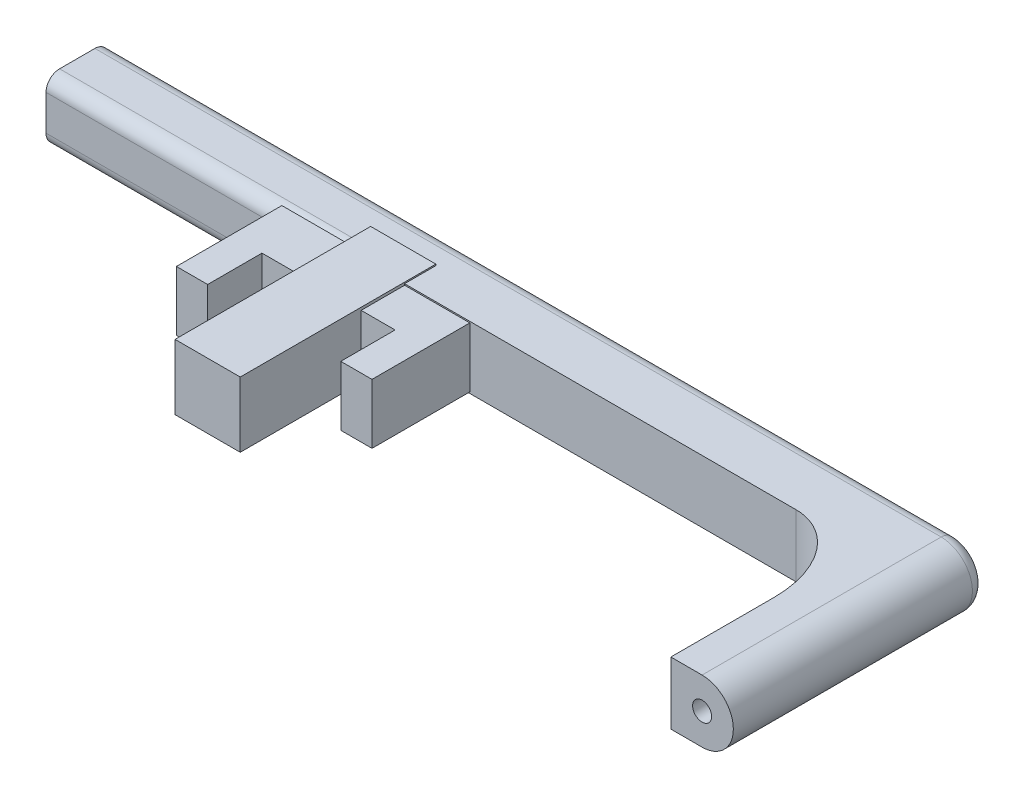
ISO-10303-21;
HEADER;
FILE_DESCRIPTION(('STEP AP214'),'2;1');
FILE_NAME('part.step','',(''),(''),'','','');
FILE_SCHEMA(('AUTOMOTIVE_DESIGN { 1 0 10303 214 1 1 1 1 }'));
ENDSEC;
DATA;
#1=APPLICATION_CONTEXT('core data for automotive mechanical design processes');
#2=APPLICATION_PROTOCOL_DEFINITION('international standard','automotive_design',2000,#1);
#3=PRODUCT_CONTEXT('',#1,'mechanical');
#4=PRODUCT('Part','Part','',(#3));
#5=PRODUCT_RELATED_PRODUCT_CATEGORY('part','',(#4));
#6=PRODUCT_DEFINITION_FORMATION('','',#4);
#7=PRODUCT_DEFINITION_CONTEXT('part definition',#1,'design');
#8=PRODUCT_DEFINITION('design','',#6,#7);
#9=PRODUCT_DEFINITION_SHAPE('','',#8);
#10=(LENGTH_UNIT() NAMED_UNIT(*) SI_UNIT(.MILLI.,.METRE.));
#11=(NAMED_UNIT(*) PLANE_ANGLE_UNIT() SI_UNIT($,.RADIAN.));
#12=(NAMED_UNIT(*) SI_UNIT($,.STERADIAN.) SOLID_ANGLE_UNIT());
#13=UNCERTAINTY_MEASURE_WITH_UNIT(LENGTH_MEASURE(1.E-05),#10,'distance_accuracy_value','');
#14=(GEOMETRIC_REPRESENTATION_CONTEXT(3) GLOBAL_UNCERTAINTY_ASSIGNED_CONTEXT((#13)) GLOBAL_UNIT_ASSIGNED_CONTEXT((#10,
#11,#12)) REPRESENTATION_CONTEXT('',''));
#15=CARTESIAN_POINT('',(0.,0.,0.));
#16=DIRECTION('',(0.,0.,1.));
#17=DIRECTION('',(1.,0.,0.));
#18=AXIS2_PLACEMENT_3D('',#15,#16,#17);
#19=CARTESIAN_POINT('',(-12.,-0.65,0.65));
#20=DIRECTION('',(1.,0.,0.));
#21=DIRECTION('',(0.,0.,-1.));
#22=AXIS2_PLACEMENT_3D('',#19,#20,#21);
#23=CYLINDRICAL_SURFACE('',#22,0.5);
#24=CARTESIAN_POINT('',(-1.2,-0.65,0.65));
#25=DIRECTION('',(1.,0.,0.));
#26=DIRECTION('',(0.,0.,-1.));
#27=AXIS2_PLACEMENT_3D('',#24,#25,#26);
#28=CIRCLE('',#27,0.5);
#29=CARTESIAN_POINT('',(-1.2,-1.1,0.867944947177033));
#30=VERTEX_POINT('',#29);
#31=CARTESIAN_POINT('',(-1.2,-1.15,0.65));
#32=VERTEX_POINT('',#31);
#33=EDGE_CURVE('E524',#30,#32,#28,.T.);
#34=ORIENTED_EDGE('',*,*,#33,.F.);
#35=DIRECTION('',(1.,0.,0.));
#36=VECTOR('',#35,1.);
#37=CARTESIAN_POINT('',(-12.,-1.1,0.867944947177034));
#38=LINE('',#37,#36);
#39=CARTESIAN_POINT('',(-3.6,-1.1,0.867944947177034));
#40=VERTEX_POINT('',#39);
#41=EDGE_CURVE('E536',#40,#30,#38,.T.);
#42=ORIENTED_EDGE('',*,*,#41,.F.);
#43=CARTESIAN_POINT('',(-3.6,-0.65,0.65));
#44=DIRECTION('',(-1.,0.,0.));
#45=DIRECTION('',(0.,-1.,0.));
#46=AXIS2_PLACEMENT_3D('',#43,#44,#45);
#47=CIRCLE('',#46,0.5);
#48=CARTESIAN_POINT('',(-3.6,-0.65,1.15));
#49=VERTEX_POINT('',#48);
#50=EDGE_CURVE('E306',#49,#40,#47,.F.);
#51=ORIENTED_EDGE('',*,*,#50,.F.);
#52=DIRECTION('',(1.,0.,0.));
#53=VECTOR('',#52,1.);
#54=CARTESIAN_POINT('',(-12.,-0.65,1.15));
#55=LINE('',#54,#53);
#56=CARTESIAN_POINT('',(-12.,-0.65,1.15));
#57=VERTEX_POINT('',#56);
#58=EDGE_CURVE('E516',#57,#49,#55,.T.);
#59=ORIENTED_EDGE('',*,*,#58,.F.);
#60=CARTESIAN_POINT('',(-12.,-0.65,0.65));
#61=DIRECTION('',(-1.,0.,0.));
#62=DIRECTION('',(0.,0.,1.));
#63=AXIS2_PLACEMENT_3D('',#60,#61,#62);
#64=CIRCLE('',#63,0.5);
#65=CARTESIAN_POINT('',(-12.,-1.15,0.65));
#66=VERTEX_POINT('',#65);
#67=EDGE_CURVE('E508',#66,#57,#64,.T.);
#68=ORIENTED_EDGE('',*,*,#67,.F.);
#69=DIRECTION('',(1.,0.,0.));
#70=VECTOR('',#69,1.);
#71=CARTESIAN_POINT('',(-12.,-1.15,0.65));
#72=LINE('',#71,#70);
#73=EDGE_CURVE('E487',#32,#66,#72,.F.);
#74=ORIENTED_EDGE('',*,*,#73,.F.);
#75=EDGE_LOOP('',(#34,#42,#51,#59,#68,#74));
#76=FACE_BOUND('',#75,.T.);
#77=ADVANCED_FACE('F43',(#76),#23,.T.);
#78=CARTESIAN_POINT('',(-12.,0.65,0.65));
#79=DIRECTION('',(1.,0.,0.));
#80=DIRECTION('',(0.,0.,-1.));
#81=AXIS2_PLACEMENT_3D('',#78,#79,#80);
#82=CYLINDRICAL_SURFACE('',#81,0.5);
#83=DIRECTION('',(1.,0.,0.));
#84=VECTOR('',#83,1.);
#85=CARTESIAN_POINT('',(-12.,1.1,0.867944947177033));
#86=LINE('',#85,#84);
#87=CARTESIAN_POINT('',(-3.6,1.1,0.867944947177033));
#88=VERTEX_POINT('',#87);
#89=CARTESIAN_POINT('',(-1.2,1.1,0.867944947177033));
#90=VERTEX_POINT('',#89);
#91=EDGE_CURVE('E534',#88,#90,#86,.T.);
#92=ORIENTED_EDGE('',*,*,#91,.T.);
#93=CARTESIAN_POINT('',(-1.2,0.65,0.65));
#94=DIRECTION('',(1.,0.,0.));
#95=DIRECTION('',(0.,0.,-1.));
#96=AXIS2_PLACEMENT_3D('',#93,#94,#95);
#97=CIRCLE('',#96,0.5);
#98=CARTESIAN_POINT('',(-1.2,1.15,0.65));
#99=VERTEX_POINT('',#98);
#100=EDGE_CURVE('E526',#99,#90,#97,.T.);
#101=ORIENTED_EDGE('',*,*,#100,.F.);
#102=DIRECTION('',(1.,0.,0.));
#103=VECTOR('',#102,1.);
#104=CARTESIAN_POINT('',(-12.,1.15,0.65));
#105=LINE('',#104,#103);
#106=CARTESIAN_POINT('',(-12.,1.15,0.65));
#107=VERTEX_POINT('',#106);
#108=EDGE_CURVE('E521',#107,#99,#105,.T.);
#109=ORIENTED_EDGE('',*,*,#108,.F.);
#110=CARTESIAN_POINT('',(-12.,0.65,0.65));
#111=DIRECTION('',(-1.,0.,0.));
#112=DIRECTION('',(0.,0.,1.));
#113=AXIS2_PLACEMENT_3D('',#110,#111,#112);
#114=CIRCLE('',#113,0.5);
#115=CARTESIAN_POINT('',(-12.,0.65,1.15));
#116=VERTEX_POINT('',#115);
#117=EDGE_CURVE('E506',#116,#107,#114,.T.);
#118=ORIENTED_EDGE('',*,*,#117,.F.);
#119=DIRECTION('',(1.,0.,0.));
#120=VECTOR('',#119,1.);
#121=CARTESIAN_POINT('',(-12.,0.65,1.15));
#122=LINE('',#121,#120);
#123=CARTESIAN_POINT('',(-3.6,0.65,1.15));
#124=VERTEX_POINT('',#123);
#125=EDGE_CURVE('E514',#124,#116,#122,.F.);
#126=ORIENTED_EDGE('',*,*,#125,.F.);
#127=CARTESIAN_POINT('',(-3.6,0.65,0.65));
#128=DIRECTION('',(-1.,0.,0.));
#129=DIRECTION('',(0.,-1.,0.));
#130=AXIS2_PLACEMENT_3D('',#127,#128,#129);
#131=CIRCLE('',#130,0.5);
#132=EDGE_CURVE('E528',#88,#124,#131,.F.);
#133=ORIENTED_EDGE('',*,*,#132,.F.);
#134=EDGE_LOOP('',(#92,#101,#109,#118,#126,#133));
#135=FACE_BOUND('',#134,.T.);
#136=ADVANCED_FACE('F45',(#135),#82,.T.);
#137=CARTESIAN_POINT('',(1.2,-1.2,7.2));
#138=DIRECTION('',(-1.,0.,0.));
#139=DIRECTION('',(0.,0.,1.));
#140=AXIS2_PLACEMENT_3D('',#137,#138,#139);
#141=PLANE('',#140);
#142=DIRECTION('',(0.,0.,1.));
#143=VECTOR('',#142,1.);
#144=CARTESIAN_POINT('',(1.2,1.1,7.2));
#145=LINE('',#144,#143);
#146=CARTESIAN_POINT('',(1.2,1.1,1.15));
#147=VERTEX_POINT('',#146);
#148=CARTESIAN_POINT('',(1.2,1.1,2.75));
#149=VERTEX_POINT('',#148);
#150=EDGE_CURVE('E264',#147,#149,#145,.T.);
#151=ORIENTED_EDGE('',*,*,#150,.F.);
#152=DIRECTION('',(0.,1.,0.));
#153=VECTOR('',#152,1.);
#154=CARTESIAN_POINT('',(1.2,-1.2,1.15));
#155=LINE('',#154,#153);
#156=CARTESIAN_POINT('',(1.2,1.15,1.15));
#157=VERTEX_POINT('',#156);
#158=EDGE_CURVE('E567',#147,#157,#155,.T.);
#159=ORIENTED_EDGE('',*,*,#158,.T.);
#160=DIRECTION('',(0.,0.,-1.));
#161=VECTOR('',#160,1.);
#162=CARTESIAN_POINT('',(1.2,1.15,7.2));
#163=LINE('',#162,#161);
#164=CARTESIAN_POINT('',(1.2,1.15,0.));
#165=VERTEX_POINT('',#164);
#166=EDGE_CURVE('E661',#157,#165,#163,.T.);
#167=ORIENTED_EDGE('',*,*,#166,.T.);
#168=DIRECTION('',(0.,1.,0.));
#169=VECTOR('',#168,1.);
#170=CARTESIAN_POINT('',(1.2,-1.2,0.));
#171=LINE('',#170,#169);
#172=CARTESIAN_POINT('',(1.2,1.2,0.));
#173=VERTEX_POINT('',#172);
#174=EDGE_CURVE('E566',#165,#173,#171,.T.);
#175=ORIENTED_EDGE('',*,*,#174,.T.);
#176=DIRECTION('',(0.,0.,-1.));
#177=VECTOR('',#176,1.);
#178=CARTESIAN_POINT('',(1.2,1.2,7.2));
#179=LINE('',#178,#177);
#180=CARTESIAN_POINT('',(1.2,1.2,7.2));
#181=VERTEX_POINT('',#180);
#182=EDGE_CURVE('E600',#181,#173,#179,.T.);
#183=ORIENTED_EDGE('',*,*,#182,.F.);
#184=DIRECTION('',(0.,1.,0.));
#185=VECTOR('',#184,1.);
#186=CARTESIAN_POINT('',(1.2,-1.2,7.2));
#187=LINE('',#186,#185);
#188=CARTESIAN_POINT('',(1.2,-1.2,7.2));
#189=VERTEX_POINT('',#188);
#190=EDGE_CURVE('E574',#189,#181,#187,.T.);
#191=ORIENTED_EDGE('',*,*,#190,.F.);
#192=DIRECTION('',(0.,0.,-1.));
#193=VECTOR('',#192,1.);
#194=CARTESIAN_POINT('',(1.2,-1.2,7.2));
#195=LINE('',#194,#193);
#196=CARTESIAN_POINT('',(1.2,-1.2,0.));
#197=VERTEX_POINT('',#196);
#198=EDGE_CURVE('E583',#189,#197,#195,.T.);
#199=ORIENTED_EDGE('',*,*,#198,.T.);
#200=CARTESIAN_POINT('',(1.2,-1.15,0.));
#201=VERTEX_POINT('',#200);
#202=EDGE_CURVE('E569',#197,#201,#171,.T.);
#203=ORIENTED_EDGE('',*,*,#202,.T.);
#204=DIRECTION('',(0.,0.,1.));
#205=VECTOR('',#204,1.);
#206=CARTESIAN_POINT('',(1.2,-1.15,7.2));
#207=LINE('',#206,#205);
#208=CARTESIAN_POINT('',(1.2,-1.15,1.15));
#209=VERTEX_POINT('',#208);
#210=EDGE_CURVE('E564',#201,#209,#207,.T.);
#211=ORIENTED_EDGE('',*,*,#210,.T.);
#212=CARTESIAN_POINT('',(1.2,-1.1,1.15));
#213=VERTEX_POINT('',#212);
#214=EDGE_CURVE('E561',#209,#213,#155,.T.);
#215=ORIENTED_EDGE('',*,*,#214,.T.);
#216=DIRECTION('',(0.,0.,-1.));
#217=VECTOR('',#216,1.);
#218=CARTESIAN_POINT('',(1.2,-1.1,7.2));
#219=LINE('',#218,#217);
#220=CARTESIAN_POINT('',(1.2,-1.1,2.75));
#221=VERTEX_POINT('',#220);
#222=EDGE_CURVE('E555',#221,#213,#219,.T.);
#223=ORIENTED_EDGE('',*,*,#222,.F.);
#224=DIRECTION('',(0.,-1.,0.));
#225=VECTOR('',#224,1.);
#226=CARTESIAN_POINT('',(1.2,-1.2,2.75));
#227=LINE('',#226,#225);
#228=EDGE_CURVE('E559',#149,#221,#227,.T.);
#229=ORIENTED_EDGE('',*,*,#228,.F.);
#230=EDGE_LOOP('',(#151,#159,#167,#175,#183,#191,#199,#203,#211,#215,#223,#229));
#231=FACE_BOUND('',#230,.T.);
#232=ADVANCED_FACE('F448',(#231),#141,.F.);
#233=CARTESIAN_POINT('',(-1.2,-1.2,7.2));
#234=DIRECTION('',(1.,0.,0.));
#235=DIRECTION('',(0.,0.,-1.));
#236=AXIS2_PLACEMENT_3D('',#233,#234,#235);
#237=PLANE('',#236);
#238=DIRECTION('',(0.,0.,-1.));
#239=VECTOR('',#238,1.);
#240=CARTESIAN_POINT('',(-1.2,1.1,7.2));
#241=LINE('',#240,#239);
#242=CARTESIAN_POINT('',(-1.2,1.1,2.75));
#243=VERTEX_POINT('',#242);
#244=EDGE_CURVE('E58',#243,#90,#241,.T.);
#245=ORIENTED_EDGE('',*,*,#244,.F.);
#246=DIRECTION('',(0.,1.,0.));
#247=VECTOR('',#246,1.);
#248=CARTESIAN_POINT('',(-1.2,-1.2,2.75));
#249=LINE('',#248,#247);
#250=CARTESIAN_POINT('',(-1.2,-1.1,2.75));
#251=VERTEX_POINT('',#250);
#252=EDGE_CURVE('E62',#251,#243,#249,.T.);
#253=ORIENTED_EDGE('',*,*,#252,.F.);
#254=DIRECTION('',(0.,0.,1.));
#255=VECTOR('',#254,1.);
#256=CARTESIAN_POINT('',(-1.2,-1.1,7.2));
#257=LINE('',#256,#255);
#258=EDGE_CURVE('E558',#30,#251,#257,.T.);
#259=ORIENTED_EDGE('',*,*,#258,.F.);
#260=ORIENTED_EDGE('',*,*,#33,.T.);
#261=DIRECTION('',(0.,0.,-1.));
#262=VECTOR('',#261,1.);
#263=CARTESIAN_POINT('',(-1.2,-1.15,7.2));
#264=LINE('',#263,#262);
#265=CARTESIAN_POINT('',(-1.2,-1.15,0.));
#266=VERTEX_POINT('',#265);
#267=EDGE_CURVE('E648',#32,#266,#264,.T.);
#268=ORIENTED_EDGE('',*,*,#267,.T.);
#269=DIRECTION('',(0.,-1.,0.));
#270=VECTOR('',#269,1.);
#271=CARTESIAN_POINT('',(-1.2,-1.2,0.));
#272=LINE('',#271,#270);
#273=CARTESIAN_POINT('',(-1.2,-1.2,0.));
#274=VERTEX_POINT('',#273);
#275=EDGE_CURVE('E587',#266,#274,#272,.T.);
#276=ORIENTED_EDGE('',*,*,#275,.T.);
#277=DIRECTION('',(0.,0.,-1.));
#278=VECTOR('',#277,1.);
#279=CARTESIAN_POINT('',(-1.2,-1.2,7.2));
#280=LINE('',#279,#278);
#281=CARTESIAN_POINT('',(-1.2,-1.2,7.2));
#282=VERTEX_POINT('',#281);
#283=EDGE_CURVE('E594',#282,#274,#280,.T.);
#284=ORIENTED_EDGE('',*,*,#283,.F.);
#285=DIRECTION('',(0.,-1.,0.));
#286=VECTOR('',#285,1.);
#287=CARTESIAN_POINT('',(-1.2,-1.2,7.2));
#288=LINE('',#287,#286);
#289=CARTESIAN_POINT('',(-1.2,1.2,7.2));
#290=VERTEX_POINT('',#289);
#291=EDGE_CURVE('E580',#290,#282,#288,.T.);
#292=ORIENTED_EDGE('',*,*,#291,.F.);
#293=DIRECTION('',(0.,0.,-1.));
#294=VECTOR('',#293,1.);
#295=CARTESIAN_POINT('',(-1.2,1.2,7.2));
#296=LINE('',#295,#294);
#297=CARTESIAN_POINT('',(-1.2,1.2,0.));
#298=VERTEX_POINT('',#297);
#299=EDGE_CURVE('E597',#290,#298,#296,.T.);
#300=ORIENTED_EDGE('',*,*,#299,.T.);
#301=CARTESIAN_POINT('',(-1.2,1.15,0.));
#302=VERTEX_POINT('',#301);
#303=EDGE_CURVE('E588',#298,#302,#272,.T.);
#304=ORIENTED_EDGE('',*,*,#303,.T.);
#305=DIRECTION('',(0.,0.,1.));
#306=VECTOR('',#305,1.);
#307=CARTESIAN_POINT('',(-1.2,1.15,7.2));
#308=LINE('',#307,#306);
#309=EDGE_CURVE('E374',#302,#99,#308,.T.);
#310=ORIENTED_EDGE('',*,*,#309,.T.);
#311=ORIENTED_EDGE('',*,*,#100,.T.);
#312=EDGE_LOOP('',(#245,#253,#259,#260,#268,#276,#284,#292,#300,#304,#310,#311));
#313=FACE_BOUND('',#312,.T.);
#314=ADVANCED_FACE('F401',(#313),#237,.F.);
#315=CARTESIAN_POINT('',(-12.,-1.15,1.15));
#316=DIRECTION('',(0.,0.,1.));
#317=DIRECTION('',(1.,0.,0.));
#318=AXIS2_PLACEMENT_3D('',#315,#316,#317);
#319=PLANE('',#318);
#320=ORIENTED_EDGE('',*,*,#158,.F.);
#321=DIRECTION('',(-1.,0.,0.));
#322=VECTOR('',#321,1.);
#323=CARTESIAN_POINT('',(-12.,1.1,1.15));
#324=LINE('',#323,#322);
#325=CARTESIAN_POINT('',(3.6,1.1,1.15));
#326=VERTEX_POINT('',#325);
#327=EDGE_CURVE('E538',#326,#147,#324,.T.);
#328=ORIENTED_EDGE('',*,*,#327,.F.);
#329=DIRECTION('',(0.,1.,0.));
#330=VECTOR('',#329,1.);
#331=CARTESIAN_POINT('',(3.6,-1.15,1.15));
#332=LINE('',#331,#330);
#333=CARTESIAN_POINT('',(3.6,-1.1,1.15));
#334=VERTEX_POINT('',#333);
#335=EDGE_CURVE('E51',#334,#326,#332,.T.);
#336=ORIENTED_EDGE('',*,*,#335,.F.);
#337=DIRECTION('',(-1.,0.,0.));
#338=VECTOR('',#337,1.);
#339=CARTESIAN_POINT('',(-12.,-1.1,1.15));
#340=LINE('',#339,#338);
#341=EDGE_CURVE('E12',#334,#213,#340,.T.);
#342=ORIENTED_EDGE('',*,*,#341,.T.);
#343=ORIENTED_EDGE('',*,*,#214,.F.);
#344=DIRECTION('',(1.,0.,0.));
#345=VECTOR('',#344,1.);
#346=CARTESIAN_POINT('',(-12.,-1.15,1.15));
#347=LINE('',#346,#345);
#348=CARTESIAN_POINT('',(15.6,-1.15,1.15));
#349=VERTEX_POINT('',#348);
#350=EDGE_CURVE('E371',#209,#349,#347,.T.);
#351=ORIENTED_EDGE('',*,*,#350,.T.);
#352=CARTESIAN_POINT('',(15.6,1.265,1.15));
#353=CARTESIAN_POINT('',(15.6,0.421666666666668,1.15));
#354=CARTESIAN_POINT('',(15.6,-0.421666666666668,1.15));
#355=CARTESIAN_POINT('',(15.6,-1.265,1.15));
#356=(BOUNDED_CURVE() B_SPLINE_CURVE(3,(#352,#353,#354,#355),.UNSPECIFIED.,.F.,
.F.) B_SPLINE_CURVE_WITH_KNOTS((4,4),(-0.001265,0.001265),
.UNSPECIFIED.) CURVE() GEOMETRIC_REPRESENTATION_ITEM() RATIONAL_B_SPLINE_CURVE((1.,1.,1.,1.)) REPRESENTATION_ITEM(''));
#357=CARTESIAN_POINT('',(15.6,1.15,1.15));
#358=VERTEX_POINT('',#357);
#359=EDGE_CURVE('E384',#349,#358,#356,.F.);
#360=ORIENTED_EDGE('',*,*,#359,.T.);
#361=DIRECTION('',(1.,0.,0.));
#362=VECTOR('',#361,1.);
#363=CARTESIAN_POINT('',(-12.,1.15,1.15));
#364=LINE('',#363,#362);
#365=EDGE_CURVE('E365',#157,#358,#364,.T.);
#366=ORIENTED_EDGE('',*,*,#365,.F.);
#367=EDGE_LOOP('',(#320,#328,#336,#342,#343,#351,#360,#366));
#368=FACE_BOUND('',#367,.T.);
#369=ADVANCED_FACE('F390',(#368),#319,.T.);
#370=CARTESIAN_POINT('',(-2.45,0.,-0.65));
#371=DIRECTION('',(-1.,0.,0.));
#372=DIRECTION('',(0.,-1.,0.));
#373=AXIS2_PLACEMENT_3D('',#370,#371,#372);
#374=PLANE('',#373);
#375=DIRECTION('',(0.,-1.,0.));
#376=VECTOR('',#375,1.);
#377=CARTESIAN_POINT('',(-2.45,0.,2.75));
#378=LINE('',#377,#376);
#379=CARTESIAN_POINT('',(-2.45,1.1,2.75));
#380=VERTEX_POINT('',#379);
#381=CARTESIAN_POINT('',(-2.45,-1.1,2.75));
#382=VERTEX_POINT('',#381);
#383=EDGE_CURVE('E255',#380,#382,#378,.T.);
#384=ORIENTED_EDGE('',*,*,#383,.F.);
#385=DIRECTION('',(0.,0.,1.));
#386=VECTOR('',#385,1.);
#387=CARTESIAN_POINT('',(-2.45,1.1,-0.65));
#388=LINE('',#387,#386);
#389=CARTESIAN_POINT('',(-2.45,1.1,4.75));
#390=VERTEX_POINT('',#389);
#391=EDGE_CURVE('E296',#380,#390,#388,.T.);
#392=ORIENTED_EDGE('',*,*,#391,.T.);
#393=DIRECTION('',(0.,-1.,0.));
#394=VECTOR('',#393,1.);
#395=CARTESIAN_POINT('',(-2.45,0.,4.75));
#396=LINE('',#395,#394);
#397=CARTESIAN_POINT('',(-2.45,-1.1,4.75));
#398=VERTEX_POINT('',#397);
#399=EDGE_CURVE('E292',#390,#398,#396,.T.);
#400=ORIENTED_EDGE('',*,*,#399,.T.);
#401=DIRECTION('',(0.,0.,1.));
#402=VECTOR('',#401,1.);
#403=CARTESIAN_POINT('',(-2.45,-1.1,-0.65));
#404=LINE('',#403,#402);
#405=EDGE_CURVE('E299',#382,#398,#404,.T.);
#406=ORIENTED_EDGE('',*,*,#405,.F.);
#407=EDGE_LOOP('',(#384,#392,#400,#406));
#408=FACE_BOUND('',#407,.T.);
#409=ADVANCED_FACE('F400',(#408),#374,.F.);
#410=CARTESIAN_POINT('',(2.45,0.,4.75));
#411=DIRECTION('',(-1.,0.,0.));
#412=DIRECTION('',(0.,0.,1.));
#413=AXIS2_PLACEMENT_3D('',#410,#411,#412);
#414=PLANE('',#413);
#415=DIRECTION('',(0.,0.,-1.));
#416=VECTOR('',#415,1.);
#417=CARTESIAN_POINT('',(2.45,1.1,4.75));
#418=LINE('',#417,#416);
#419=CARTESIAN_POINT('',(2.45,1.1,4.75));
#420=VERTEX_POINT('',#419);
#421=CARTESIAN_POINT('',(2.45,1.1,2.75));
#422=VERTEX_POINT('',#421);
#423=EDGE_CURVE('E261',#420,#422,#418,.T.);
#424=ORIENTED_EDGE('',*,*,#423,.T.);
#425=DIRECTION('',(0.,-1.,0.));
#426=VECTOR('',#425,1.);
#427=CARTESIAN_POINT('',(2.45,0.,2.75));
#428=LINE('',#427,#426);
#429=CARTESIAN_POINT('',(2.45,-1.1,2.75));
#430=VERTEX_POINT('',#429);
#431=EDGE_CURVE('E245',#422,#430,#428,.T.);
#432=ORIENTED_EDGE('',*,*,#431,.T.);
#433=DIRECTION('',(0.,0.,-1.));
#434=VECTOR('',#433,1.);
#435=CARTESIAN_POINT('',(2.45,-1.1,4.75));
#436=LINE('',#435,#434);
#437=CARTESIAN_POINT('',(2.45,-1.1,4.75));
#438=VERTEX_POINT('',#437);
#439=EDGE_CURVE('E281',#438,#430,#436,.T.);
#440=ORIENTED_EDGE('',*,*,#439,.F.);
#441=DIRECTION('',(0.,1.,0.));
#442=VECTOR('',#441,1.);
#443=CARTESIAN_POINT('',(2.45,0.,4.75));
#444=LINE('',#443,#442);
#445=EDGE_CURVE('E269',#438,#420,#444,.T.);
#446=ORIENTED_EDGE('',*,*,#445,.T.);
#447=EDGE_LOOP('',(#424,#432,#440,#446));
#448=FACE_BOUND('',#447,.T.);
#449=ADVANCED_FACE('F267',(#448),#414,.T.);
#450=CARTESIAN_POINT('',(0.,0.,0.));
#451=DIRECTION('',(0.,0.,-1.));
#452=DIRECTION('',(-1.,0.,0.));
#453=AXIS2_PLACEMENT_3D('',#450,#451,#452);
#454=PLANE('',#453);
#455=DIRECTION('',(-1.,0.,0.));
#456=VECTOR('',#455,1.);
#457=CARTESIAN_POINT('',(0.,-1.15,0.));
#458=LINE('',#457,#456);
#459=EDGE_CURVE('E342',#201,#266,#458,.T.);
#460=ORIENTED_EDGE('',*,*,#459,.F.);
#461=ORIENTED_EDGE('',*,*,#202,.F.);
#462=DIRECTION('',(1.,0.,0.));
#463=VECTOR('',#462,1.);
#464=CARTESIAN_POINT('',(-1.2,-1.2,0.));
#465=LINE('',#464,#463);
#466=EDGE_CURVE('E578',#274,#197,#465,.T.);
#467=ORIENTED_EDGE('',*,*,#466,.F.);
#468=ORIENTED_EDGE('',*,*,#275,.F.);
#469=EDGE_LOOP('',(#460,#461,#467,#468));
#470=FACE_BOUND('',#469,.T.);
#471=ADVANCED_FACE('F668',(#470),#454,.T.);
#472=CARTESIAN_POINT('',(-1.2,1.2,7.2));
#473=DIRECTION('',(0.,-1.,0.));
#474=DIRECTION('',(0.,0.,-1.));
#475=AXIS2_PLACEMENT_3D('',#472,#473,#474);
#476=PLANE('',#475);
#477=DIRECTION('',(-1.,0.,0.));
#478=VECTOR('',#477,1.);
#479=CARTESIAN_POINT('',(-1.2,1.2,0.));
#480=LINE('',#479,#478);
#481=EDGE_CURVE('E585',#173,#298,#480,.T.);
#482=ORIENTED_EDGE('',*,*,#481,.T.);
#483=ORIENTED_EDGE('',*,*,#299,.F.);
#484=DIRECTION('',(-1.,0.,0.));
#485=VECTOR('',#484,1.);
#486=CARTESIAN_POINT('',(-1.2,1.2,7.2));
#487=LINE('',#486,#485);
#488=EDGE_CURVE('E577',#181,#290,#487,.T.);
#489=ORIENTED_EDGE('',*,*,#488,.F.);
#490=ORIENTED_EDGE('',*,*,#182,.T.);
#491=EDGE_LOOP('',(#482,#483,#489,#490));
#492=FACE_BOUND('',#491,.T.);
#493=ADVANCED_FACE('F796',(#492),#476,.F.);
#494=CARTESIAN_POINT('',(-1.2,-1.2,7.2));
#495=DIRECTION('',(0.,1.,0.));
#496=DIRECTION('',(0.,0.,1.));
#497=AXIS2_PLACEMENT_3D('',#494,#495,#496);
#498=PLANE('',#497);
#499=ORIENTED_EDGE('',*,*,#466,.T.);
#500=ORIENTED_EDGE('',*,*,#198,.F.);
#501=DIRECTION('',(1.,0.,0.));
#502=VECTOR('',#501,1.);
#503=CARTESIAN_POINT('',(-1.2,-1.2,7.2));
#504=LINE('',#503,#502);
#505=EDGE_CURVE('E582',#282,#189,#504,.T.);
#506=ORIENTED_EDGE('',*,*,#505,.F.);
#507=ORIENTED_EDGE('',*,*,#283,.T.);
#508=EDGE_LOOP('',(#499,#500,#506,#507));
#509=FACE_BOUND('',#508,.T.);
#510=ADVANCED_FACE('F672',(#509),#498,.F.);
#511=CARTESIAN_POINT('',(0.,0.,7.2));
#512=DIRECTION('',(0.,0.,-1.));
#513=DIRECTION('',(-1.,0.,0.));
#514=AXIS2_PLACEMENT_3D('',#511,#512,#513);
#515=PLANE('',#514);
#516=ORIENTED_EDGE('',*,*,#190,.T.);
#517=ORIENTED_EDGE('',*,*,#488,.T.);
#518=ORIENTED_EDGE('',*,*,#291,.T.);
#519=ORIENTED_EDGE('',*,*,#505,.T.);
#520=EDGE_LOOP('',(#516,#517,#518,#519));
#521=FACE_BOUND('',#520,.T.);
#522=ADVANCED_FACE('F677',(#521),#515,.F.);
#523=DIRECTION('',(1.,0.,0.));
#524=VECTOR('',#523,1.);
#525=CARTESIAN_POINT('',(0.,1.15,0.));
#526=LINE('',#525,#524);
#527=EDGE_CURVE('E602',#302,#165,#526,.T.);
#528=ORIENTED_EDGE('',*,*,#527,.F.);
#529=ORIENTED_EDGE('',*,*,#303,.F.);
#530=ORIENTED_EDGE('',*,*,#481,.F.);
#531=ORIENTED_EDGE('',*,*,#174,.F.);
#532=EDGE_LOOP('',(#528,#529,#530,#531));
#533=FACE_BOUND('',#532,.T.);
#534=ADVANCED_FACE('F683',(#533),#454,.T.);
#535=DIRECTION('',(0.,-1.,0.));
#536=VECTOR('',#535,1.);
#537=CARTESIAN_POINT('',(-3.6,-1.15,1.15));
#538=LINE('',#537,#536);
#539=EDGE_CURVE('E298',#124,#49,#538,.T.);
#540=ORIENTED_EDGE('',*,*,#539,.F.);
#541=ORIENTED_EDGE('',*,*,#125,.T.);
#542=DIRECTION('',(0.,-1.,0.));
#543=VECTOR('',#542,1.);
#544=CARTESIAN_POINT('',(-12.,-1.15,1.15));
#545=LINE('',#544,#543);
#546=EDGE_CURVE('E359',#116,#57,#545,.T.);
#547=ORIENTED_EDGE('',*,*,#546,.T.);
#548=ORIENTED_EDGE('',*,*,#58,.T.);
#549=EDGE_LOOP('',(#540,#541,#547,#548));
#550=FACE_BOUND('',#549,.T.);
#551=ADVANCED_FACE('F402',(#550),#319,.T.);
#552=CARTESIAN_POINT('',(-12.,-1.15,1.15));
#553=DIRECTION('',(0.,-1.,0.));
#554=DIRECTION('',(0.,0.,-1.));
#555=AXIS2_PLACEMENT_3D('',#552,#553,#554);
#556=PLANE('',#555);
#557=DIRECTION('',(0.,0.,-1.));
#558=VECTOR('',#557,1.);
#559=CARTESIAN_POINT('',(-12.,-1.15,1.15));
#560=LINE('',#559,#558);
#561=CARTESIAN_POINT('',(-12.,-1.15,-0.65));
#562=VERTEX_POINT('',#561);
#563=EDGE_CURVE('E362',#66,#562,#560,.T.);
#564=ORIENTED_EDGE('',*,*,#563,.T.);
#565=DIRECTION('',(1.,0.,0.));
#566=VECTOR('',#565,1.);
#567=CARTESIAN_POINT('',(-12.,-1.15,-0.65));
#568=LINE('',#567,#566);
#569=CARTESIAN_POINT('',(19.15,-1.15,-0.65));
#570=VERTEX_POINT('',#569);
#571=EDGE_CURVE('E494',#562,#570,#568,.T.);
#572=ORIENTED_EDGE('',*,*,#571,.T.);
#573=DIRECTION('',(0.,0.,-1.));
#574=VECTOR('',#573,1.);
#575=CARTESIAN_POINT('',(19.15,-1.15,8.15));
#576=LINE('',#575,#574);
#577=CARTESIAN_POINT('',(19.15,-1.15,8.15));
#578=VERTEX_POINT('',#577);
#579=EDGE_CURVE('E349',#578,#570,#576,.T.);
#580=ORIENTED_EDGE('',*,*,#579,.F.);
#581=DIRECTION('',(1.,0.,0.));
#582=VECTOR('',#581,1.);
#583=CARTESIAN_POINT('',(18.,-1.15,8.15));
#584=LINE('',#583,#582);
#585=CARTESIAN_POINT('',(18.,-1.15,8.15));
#586=VERTEX_POINT('',#585);
#587=EDGE_CURVE('E326',#586,#578,#584,.T.);
#588=ORIENTED_EDGE('',*,*,#587,.F.);
#589=DIRECTION('',(0.,0.,-1.));
#590=VECTOR('',#589,1.);
#591=CARTESIAN_POINT('',(18.,-1.15,8.15));
#592=LINE('',#591,#590);
#593=CARTESIAN_POINT('',(18.,-1.15,4.35));
#594=VERTEX_POINT('',#593);
#595=EDGE_CURVE('E344',#586,#594,#592,.T.);
#596=ORIENTED_EDGE('',*,*,#595,.T.);
#597=CARTESIAN_POINT('',(15.6,-1.15,1.15));
#598=CARTESIAN_POINT('',(18.,-1.15,1.15));
#599=CARTESIAN_POINT('',(18.,-1.15,4.35));
#600=(BOUNDED_CURVE() B_SPLINE_CURVE(2,(#597,#598,#599),.UNSPECIFIED.,.F.,
.F.) B_SPLINE_CURVE_WITH_KNOTS((3,3),(0.,1.),
.UNSPECIFIED.) CURVE() GEOMETRIC_REPRESENTATION_ITEM() RATIONAL_B_SPLINE_CURVE((1.,
0.707106781186548,1.)) REPRESENTATION_ITEM(''));
#601=EDGE_CURVE('E426',#594,#349,#600,.F.);
#602=ORIENTED_EDGE('',*,*,#601,.T.);
#603=ORIENTED_EDGE('',*,*,#350,.F.);
#604=ORIENTED_EDGE('',*,*,#210,.F.);
#605=ORIENTED_EDGE('',*,*,#459,.T.);
#606=ORIENTED_EDGE('',*,*,#267,.F.);
#607=ORIENTED_EDGE('',*,*,#73,.T.);
#608=EDGE_LOOP('',(#564,#572,#580,#588,#596,#602,#603,#604,#605,#606,#607));
#609=FACE_BOUND('',#608,.T.);
#610=ADVANCED_FACE('F403',(#609),#556,.T.);
#611=CARTESIAN_POINT('',(-12.,1.15,1.15));
#612=DIRECTION('',(0.,1.,0.));
#613=DIRECTION('',(0.,0.,1.));
#614=AXIS2_PLACEMENT_3D('',#611,#612,#613);
#615=PLANE('',#614);
#616=DIRECTION('',(0.,0.,1.));
#617=VECTOR('',#616,1.);
#618=CARTESIAN_POINT('',(-12.,1.15,1.15));
#619=LINE('',#618,#617);
#620=CARTESIAN_POINT('',(-12.,1.15,-0.65));
#621=VERTEX_POINT('',#620);
#622=EDGE_CURVE('E356',#621,#107,#619,.T.);
#623=ORIENTED_EDGE('',*,*,#622,.T.);
#624=ORIENTED_EDGE('',*,*,#108,.T.);
#625=ORIENTED_EDGE('',*,*,#309,.F.);
#626=ORIENTED_EDGE('',*,*,#527,.T.);
#627=ORIENTED_EDGE('',*,*,#166,.F.);
#628=ORIENTED_EDGE('',*,*,#365,.T.);
#629=CARTESIAN_POINT('',(18.,1.15,4.35));
#630=CARTESIAN_POINT('',(18.,1.15,1.15));
#631=CARTESIAN_POINT('',(15.6,1.15,1.15));
#632=(BOUNDED_CURVE() B_SPLINE_CURVE(2,(#629,#630,#631),.UNSPECIFIED.,.F.,
.F.) B_SPLINE_CURVE_WITH_KNOTS((3,3),(0.,1.),
.UNSPECIFIED.) CURVE() GEOMETRIC_REPRESENTATION_ITEM() RATIONAL_B_SPLINE_CURVE((1.,
0.707106781186548,1.)) REPRESENTATION_ITEM(''));
#633=CARTESIAN_POINT('',(18.,1.15,4.35));
#634=VERTEX_POINT('',#633);
#635=EDGE_CURVE('E495',#358,#634,#632,.F.);
#636=ORIENTED_EDGE('',*,*,#635,.T.);
#637=DIRECTION('',(0.,0.,-1.));
#638=VECTOR('',#637,1.);
#639=CARTESIAN_POINT('',(18.,1.15,8.15));
#640=LINE('',#639,#638);
#641=CARTESIAN_POINT('',(18.,1.15,8.15));
#642=VERTEX_POINT('',#641);
#643=EDGE_CURVE('E333',#642,#634,#640,.T.);
#644=ORIENTED_EDGE('',*,*,#643,.F.);
#645=DIRECTION('',(-1.,0.,0.));
#646=VECTOR('',#645,1.);
#647=CARTESIAN_POINT('',(18.,1.15,8.15));
#648=LINE('',#647,#646);
#649=CARTESIAN_POINT('',(19.15,1.15,8.15));
#650=VERTEX_POINT('',#649);
#651=EDGE_CURVE('E330',#650,#642,#648,.T.);
#652=ORIENTED_EDGE('',*,*,#651,.F.);
#653=DIRECTION('',(0.,0.,-1.));
#654=VECTOR('',#653,1.);
#655=CARTESIAN_POINT('',(19.15,1.15,8.15));
#656=LINE('',#655,#654);
#657=CARTESIAN_POINT('',(19.15,1.15,-0.65));
#658=VERTEX_POINT('',#657);
#659=EDGE_CURVE('E336',#650,#658,#656,.T.);
#660=ORIENTED_EDGE('',*,*,#659,.T.);
#661=DIRECTION('',(1.,0.,0.));
#662=VECTOR('',#661,1.);
#663=CARTESIAN_POINT('',(-12.,1.15,-0.65));
#664=LINE('',#663,#662);
#665=EDGE_CURVE('E519',#658,#621,#664,.F.);
#666=ORIENTED_EDGE('',*,*,#665,.T.);
#667=EDGE_LOOP('',(#623,#624,#625,#626,#627,#628,#636,#644,#652,#660,#666));
#668=FACE_BOUND('',#667,.T.);
#669=ADVANCED_FACE('F406',(#668),#615,.T.);
#670=CARTESIAN_POINT('',(-12.,-1.15,-1.15));
#671=DIRECTION('',(0.,0.,-1.));
#672=DIRECTION('',(-1.,0.,0.));
#673=AXIS2_PLACEMENT_3D('',#670,#671,#672);
#674=PLANE('',#673);
#675=CARTESIAN_POINT('',(19.15,0.,-1.15));
#676=DIRECTION('',(0.,0.,-1.));
#677=DIRECTION('',(-1.,0.,0.));
#678=AXIS2_PLACEMENT_3D('',#675,#676,#677);
#679=CIRCLE('',#678,0.65);
#680=CARTESIAN_POINT('',(19.15,0.65,-1.15));
#681=VERTEX_POINT('',#680);
#682=CARTESIAN_POINT('',(19.15,-0.65,-1.15));
#683=VERTEX_POINT('',#682);
#684=EDGE_CURVE('E500',#681,#683,#679,.T.);
#685=ORIENTED_EDGE('',*,*,#684,.T.);
#686=DIRECTION('',(1.,0.,0.));
#687=VECTOR('',#686,1.);
#688=CARTESIAN_POINT('',(-12.,-0.65,-1.15));
#689=LINE('',#688,#687);
#690=CARTESIAN_POINT('',(-12.,-0.65,-1.15));
#691=VERTEX_POINT('',#690);
#692=EDGE_CURVE('E502',#683,#691,#689,.F.);
#693=ORIENTED_EDGE('',*,*,#692,.T.);
#694=DIRECTION('',(0.,1.,0.));
#695=VECTOR('',#694,1.);
#696=CARTESIAN_POINT('',(-12.,-1.15,-1.15));
#697=LINE('',#696,#695);
#698=CARTESIAN_POINT('',(-12.,0.65,-1.15));
#699=VERTEX_POINT('',#698);
#700=EDGE_CURVE('E348',#691,#699,#697,.T.);
#701=ORIENTED_EDGE('',*,*,#700,.T.);
#702=DIRECTION('',(1.,0.,0.));
#703=VECTOR('',#702,1.);
#704=CARTESIAN_POINT('',(-12.,0.65,-1.15));
#705=LINE('',#704,#703);
#706=EDGE_CURVE('E498',#699,#681,#705,.T.);
#707=ORIENTED_EDGE('',*,*,#706,.T.);
#708=EDGE_LOOP('',(#685,#693,#701,#707));
#709=FACE_BOUND('',#708,.T.);
#710=CARTESIAN_POINT('',(19.15,0.,-1.15));
#711=DIRECTION('',(0.,0.,-1.));
#712=DIRECTION('',(-1.,0.,0.));
#713=AXIS2_PLACEMENT_3D('',#710,#711,#712);
#714=CIRCLE('',#713,0.350000000000001);
#715=CARTESIAN_POINT('',(18.8,0.,-1.15));
#716=VERTEX_POINT('',#715);
#717=EDGE_CURVE('E316',#716,#716,#714,.F.);
#718=ORIENTED_EDGE('',*,*,#717,.T.);
#719=EDGE_LOOP('',(#718));
#720=FACE_BOUND('',#719,.T.);
#721=ADVANCED_FACE('F410',(#709,#720),#674,.T.);
#722=CARTESIAN_POINT('',(-12.,0.,0.));
#723=DIRECTION('',(-1.,0.,0.));
#724=DIRECTION('',(0.,0.,1.));
#725=AXIS2_PLACEMENT_3D('',#722,#723,#724);
#726=PLANE('',#725);
#727=CARTESIAN_POINT('',(-12.,0.,0.));
#728=DIRECTION('',(-1.,0.,0.));
#729=DIRECTION('',(0.,0.,1.));
#730=AXIS2_PLACEMENT_3D('',#727,#728,#729);
#731=CIRCLE('',#730,0.35);
#732=CARTESIAN_POINT('',(-12.,0.,0.35));
#733=VERTEX_POINT('',#732);
#734=EDGE_CURVE('E313',#733,#733,#731,.T.);
#735=ORIENTED_EDGE('',*,*,#734,.F.);
#736=EDGE_LOOP('',(#735));
#737=FACE_BOUND('',#736,.T.);
#738=ORIENTED_EDGE('',*,*,#700,.F.);
#739=CARTESIAN_POINT('',(-12.,-0.65,-0.65));
#740=DIRECTION('',(-1.,0.,0.));
#741=DIRECTION('',(0.,0.,1.));
#742=AXIS2_PLACEMENT_3D('',#739,#740,#741);
#743=CIRCLE('',#742,0.5);
#744=EDGE_CURVE('E510',#691,#562,#743,.T.);
#745=ORIENTED_EDGE('',*,*,#744,.T.);
#746=ORIENTED_EDGE('',*,*,#563,.F.);
#747=ORIENTED_EDGE('',*,*,#67,.T.);
#748=ORIENTED_EDGE('',*,*,#546,.F.);
#749=ORIENTED_EDGE('',*,*,#117,.T.);
#750=ORIENTED_EDGE('',*,*,#622,.F.);
#751=CARTESIAN_POINT('',(-12.,0.65,-0.65));
#752=DIRECTION('',(-1.,0.,0.));
#753=DIRECTION('',(0.,0.,1.));
#754=AXIS2_PLACEMENT_3D('',#751,#752,#753);
#755=CIRCLE('',#754,0.5);
#756=EDGE_CURVE('E504',#621,#699,#755,.T.);
#757=ORIENTED_EDGE('',*,*,#756,.T.);
#758=EDGE_LOOP('',(#738,#745,#746,#747,#748,#749,#750,#757));
#759=FACE_BOUND('',#758,.T.);
#760=ADVANCED_FACE('F643',(#737,#759),#726,.T.);
#761=CARTESIAN_POINT('',(18.,0.,8.15));
#762=DIRECTION('',(1.,0.,0.));
#763=DIRECTION('',(0.,0.,-1.));
#764=AXIS2_PLACEMENT_3D('',#761,#762,#763);
#765=PLANE('',#764);
#766=ORIENTED_EDGE('',*,*,#643,.T.);
#767=CARTESIAN_POINT('',(18.,-1.265,4.35));
#768=CARTESIAN_POINT('',(18.,-0.421666666666668,4.35));
#769=CARTESIAN_POINT('',(18.,0.421666666666668,4.35));
#770=CARTESIAN_POINT('',(18.,1.265,4.35));
#771=(BOUNDED_CURVE() B_SPLINE_CURVE(3,(#767,#768,#769,#770),.UNSPECIFIED.,.F.,
.F.) B_SPLINE_CURVE_WITH_KNOTS((4,4),(-0.001265,0.001265),
.UNSPECIFIED.) CURVE() GEOMETRIC_REPRESENTATION_ITEM() RATIONAL_B_SPLINE_CURVE((1.,1.,1.,1.)) REPRESENTATION_ITEM(''));
#772=EDGE_CURVE('E607',#634,#594,#771,.F.);
#773=ORIENTED_EDGE('',*,*,#772,.T.);
#774=ORIENTED_EDGE('',*,*,#595,.F.);
#775=DIRECTION('',(0.,-1.,0.));
#776=VECTOR('',#775,1.);
#777=CARTESIAN_POINT('',(18.,0.,8.15));
#778=LINE('',#777,#776);
#779=EDGE_CURVE('E323',#642,#586,#778,.T.);
#780=ORIENTED_EDGE('',*,*,#779,.F.);
#781=EDGE_LOOP('',(#766,#773,#774,#780));
#782=FACE_BOUND('',#781,.T.);
#783=ADVANCED_FACE('F615',(#782),#765,.F.);
#784=CARTESIAN_POINT('',(19.15,0.,8.15));
#785=DIRECTION('',(0.,0.,1.));
#786=DIRECTION('',(1.,0.,0.));
#787=AXIS2_PLACEMENT_3D('',#784,#785,#786);
#788=PLANE('',#787);
#789=ORIENTED_EDGE('',*,*,#779,.T.);
#790=ORIENTED_EDGE('',*,*,#587,.T.);
#791=CARTESIAN_POINT('',(19.15,0.,8.15));
#792=DIRECTION('',(0.,0.,1.));
#793=DIRECTION('',(1.,0.,0.));
#794=AXIS2_PLACEMENT_3D('',#791,#792,#793);
#795=CIRCLE('',#794,1.15);
#796=EDGE_CURVE('E328',#578,#650,#795,.T.);
#797=ORIENTED_EDGE('',*,*,#796,.T.);
#798=ORIENTED_EDGE('',*,*,#651,.T.);
#799=EDGE_LOOP('',(#789,#790,#797,#798));
#800=FACE_BOUND('',#799,.T.);
#801=CARTESIAN_POINT('',(19.15,0.,8.15));
#802=DIRECTION('',(0.,0.,1.));
#803=DIRECTION('',(1.,0.,0.));
#804=AXIS2_PLACEMENT_3D('',#801,#802,#803);
#805=CIRCLE('',#804,0.350000000000001);
#806=CARTESIAN_POINT('',(19.5,0.,8.15));
#807=VERTEX_POINT('',#806);
#808=EDGE_CURVE('E320',#807,#807,#805,.T.);
#809=ORIENTED_EDGE('',*,*,#808,.F.);
#810=EDGE_LOOP('',(#809));
#811=FACE_BOUND('',#810,.T.);
#812=ADVANCED_FACE('F617',(#800,#811),#788,.T.);
#813=CARTESIAN_POINT('',(19.15,0.,8.15));
#814=DIRECTION('',(0.,0.,-1.));
#815=DIRECTION('',(-1.,0.,0.));
#816=AXIS2_PLACEMENT_3D('',#813,#814,#815);
#817=CYLINDRICAL_SURFACE('',#816,1.15);
#818=ORIENTED_EDGE('',*,*,#579,.T.);
#819=CARTESIAN_POINT('',(19.15,0.,-0.65));
#820=DIRECTION('',(0.,0.,-1.));
#821=DIRECTION('',(-1.,0.,0.));
#822=AXIS2_PLACEMENT_3D('',#819,#820,#821);
#823=CIRCLE('',#822,1.15);
#824=EDGE_CURVE('E512',#570,#658,#823,.F.);
#825=ORIENTED_EDGE('',*,*,#824,.T.);
#826=ORIENTED_EDGE('',*,*,#659,.F.);
#827=ORIENTED_EDGE('',*,*,#796,.F.);
#828=EDGE_LOOP('',(#818,#825,#826,#827));
#829=FACE_BOUND('',#828,.T.);
#830=ADVANCED_FACE('F745',(#829),#817,.T.);
#831=CARTESIAN_POINT('',(19.15,0.,8.15));
#832=DIRECTION('',(0.,0.,-1.));
#833=DIRECTION('',(-1.,0.,0.));
#834=AXIS2_PLACEMENT_3D('',#831,#832,#833);
#835=CYLINDRICAL_SURFACE('',#834,0.350000000000001);
#836=ORIENTED_EDGE('',*,*,#808,.T.);
#837=EDGE_LOOP('',(#836));
#838=FACE_BOUND('',#837,.T.);
#839=ORIENTED_EDGE('',*,*,#717,.F.);
#840=EDGE_LOOP('',(#839));
#841=FACE_BOUND('',#840,.T.);
#842=ADVANCED_FACE('F741',(#838,#841),#835,.F.);
#843=CARTESIAN_POINT('',(-2.,0.,0.));
#844=DIRECTION('',(-1.,0.,0.));
#845=DIRECTION('',(0.,0.,1.));
#846=AXIS2_PLACEMENT_3D('',#843,#844,#845);
#847=CYLINDRICAL_SURFACE('',#846,0.35);
#848=CARTESIAN_POINT('',(-3.6,0.,0.));
#849=DIRECTION('',(-1.,0.,0.));
#850=DIRECTION('',(0.,-1.,0.));
#851=AXIS2_PLACEMENT_3D('',#848,#849,#850);
#852=CIRCLE('',#851,0.35);
#853=CARTESIAN_POINT('',(-3.6,-0.35,0.));
#854=VERTEX_POINT('',#853);
#855=EDGE_CURVE('E309',#854,#854,#852,.F.);
#856=ORIENTED_EDGE('',*,*,#855,.T.);
#857=EDGE_LOOP('',(#856));
#858=FACE_BOUND('',#857,.T.);
#859=ORIENTED_EDGE('',*,*,#734,.T.);
#860=EDGE_LOOP('',(#859));
#861=FACE_BOUND('',#860,.T.);
#862=ADVANCED_FACE('F447',(#858,#861),#847,.F.);
#863=CARTESIAN_POINT('',(18.,1.265,4.35));
#864=CARTESIAN_POINT('',(18.,0.421666666666668,4.35));
#865=CARTESIAN_POINT('',(18.,-0.421666666666668,4.35));
#866=CARTESIAN_POINT('',(18.,-1.265,4.35));
#867=CARTESIAN_POINT('',(18.,1.265,1.15));
#868=CARTESIAN_POINT('',(18.,0.421666666666668,1.15));
#869=CARTESIAN_POINT('',(18.,-0.421666666666668,1.15));
#870=CARTESIAN_POINT('',(18.,-1.265,1.15));
#871=CARTESIAN_POINT('',(15.6,1.265,1.15));
#872=CARTESIAN_POINT('',(15.6,0.421666666666668,1.15));
#873=CARTESIAN_POINT('',(15.6,-0.421666666666668,1.15));
#874=CARTESIAN_POINT('',(15.6,-1.265,1.15));
#875=(BOUNDED_SURFACE() B_SPLINE_SURFACE(2,3,((#863,#864,#865,#866),(#867,#868,#869,#870),(#871,
#872,#873,#874)),.UNSPECIFIED.,.F.,.F.,.F.) B_SPLINE_SURFACE_WITH_KNOTS((3,3),(4,4),(0.,1.),
(-0.001265,0.001265),
.UNSPECIFIED.) GEOMETRIC_REPRESENTATION_ITEM() RATIONAL_B_SPLINE_SURFACE(((1.,1.,1.,1.),
(0.707106781186548,0.707106781186548,0.707106781186548,0.707106781186548),(1.,1.,1.,1.))) REPRESENTATION_ITEM('') SURFACE());
#876=ORIENTED_EDGE('',*,*,#635,.F.);
#877=ORIENTED_EDGE('',*,*,#359,.F.);
#878=ORIENTED_EDGE('',*,*,#601,.F.);
#879=ORIENTED_EDGE('',*,*,#772,.F.);
#880=EDGE_LOOP('',(#876,#877,#878,#879));
#881=FACE_BOUND('',#880,.T.);
#882=ADVANCED_FACE('F432',(#881),#875,.T.);
#883=CARTESIAN_POINT('',(-12.,0.65,-0.65));
#884=DIRECTION('',(1.,0.,0.));
#885=DIRECTION('',(0.,0.,-1.));
#886=AXIS2_PLACEMENT_3D('',#883,#884,#885);
#887=CYLINDRICAL_SURFACE('',#886,0.5);
#888=ORIENTED_EDGE('',*,*,#756,.F.);
#889=ORIENTED_EDGE('',*,*,#665,.F.);
#890=CARTESIAN_POINT('',(19.15,0.65,-0.65));
#891=DIRECTION('',(1.,0.,0.));
#892=DIRECTION('',(0.,0.,-1.));
#893=AXIS2_PLACEMENT_3D('',#890,#891,#892);
#894=CIRCLE('',#893,0.5);
#895=EDGE_CURVE('E317',#681,#658,#894,.T.);
#896=ORIENTED_EDGE('',*,*,#895,.F.);
#897=ORIENTED_EDGE('',*,*,#706,.F.);
#898=EDGE_LOOP('',(#888,#889,#896,#897));
#899=FACE_BOUND('',#898,.T.);
#900=ADVANCED_FACE('F446',(#899),#887,.T.);
#901=CARTESIAN_POINT('',(19.15,0.,-0.65));
#902=DIRECTION('',(0.,0.,-1.));
#903=DIRECTION('',(-1.,0.,0.));
#904=AXIS2_PLACEMENT_3D('',#901,#902,#903);
#905=TOROIDAL_SURFACE('',#904,0.65,0.5);
#906=ORIENTED_EDGE('',*,*,#895,.T.);
#907=ORIENTED_EDGE('',*,*,#824,.F.);
#908=CARTESIAN_POINT('',(19.15,-0.65,-0.65));
#909=DIRECTION('',(-1.,0.,0.));
#910=DIRECTION('',(0.,0.,1.));
#911=AXIS2_PLACEMENT_3D('',#908,#909,#910);
#912=CIRCLE('',#911,0.5);
#913=EDGE_CURVE('E312',#683,#570,#912,.T.);
#914=ORIENTED_EDGE('',*,*,#913,.F.);
#915=ORIENTED_EDGE('',*,*,#684,.F.);
#916=EDGE_LOOP('',(#906,#907,#914,#915));
#917=FACE_BOUND('',#916,.T.);
#918=ADVANCED_FACE('F632',(#917),#905,.T.);
#919=CARTESIAN_POINT('',(-12.,-0.65,-0.65));
#920=DIRECTION('',(1.,0.,0.));
#921=DIRECTION('',(0.,0.,-1.));
#922=AXIS2_PLACEMENT_3D('',#919,#920,#921);
#923=CYLINDRICAL_SURFACE('',#922,0.5);
#924=ORIENTED_EDGE('',*,*,#744,.F.);
#925=ORIENTED_EDGE('',*,*,#692,.F.);
#926=ORIENTED_EDGE('',*,*,#913,.T.);
#927=ORIENTED_EDGE('',*,*,#571,.F.);
#928=EDGE_LOOP('',(#924,#925,#926,#927));
#929=FACE_BOUND('',#928,.T.);
#930=ADVANCED_FACE('F450',(#929),#923,.T.);
#931=CARTESIAN_POINT('',(0.,0.,4.75));
#932=DIRECTION('',(0.,0.,1.));
#933=DIRECTION('',(1.,0.,0.));
#934=AXIS2_PLACEMENT_3D('',#931,#932,#933);
#935=PLANE('',#934);
#936=DIRECTION('',(1.,0.,0.));
#937=VECTOR('',#936,1.);
#938=CARTESIAN_POINT('',(0.,1.1,4.75));
#939=LINE('',#938,#937);
#940=CARTESIAN_POINT('',(-3.6,1.1,4.75));
#941=VERTEX_POINT('',#940);
#942=EDGE_CURVE('E283',#941,#390,#939,.T.);
#943=ORIENTED_EDGE('',*,*,#942,.F.);
#944=DIRECTION('',(0.,-1.,0.));
#945=VECTOR('',#944,1.);
#946=CARTESIAN_POINT('',(-3.6,0.,4.75));
#947=LINE('',#946,#945);
#948=CARTESIAN_POINT('',(-3.6,-1.1,4.75));
#949=VERTEX_POINT('',#948);
#950=EDGE_CURVE('E286',#941,#949,#947,.T.);
#951=ORIENTED_EDGE('',*,*,#950,.T.);
#952=DIRECTION('',(1.,0.,0.));
#953=VECTOR('',#952,1.);
#954=CARTESIAN_POINT('',(0.,-1.1,4.75));
#955=LINE('',#954,#953);
#956=EDGE_CURVE('E289',#949,#398,#955,.T.);
#957=ORIENTED_EDGE('',*,*,#956,.T.);
#958=ORIENTED_EDGE('',*,*,#399,.F.);
#959=EDGE_LOOP('',(#943,#951,#957,#958));
#960=FACE_BOUND('',#959,.T.);
#961=ADVANCED_FACE('F711',(#960),#935,.T.);
#962=CARTESIAN_POINT('',(-3.6,0.,-0.65));
#963=DIRECTION('',(-1.,0.,0.));
#964=DIRECTION('',(0.,-1.,0.));
#965=AXIS2_PLACEMENT_3D('',#962,#963,#964);
#966=PLANE('',#965);
#967=DIRECTION('',(0.,0.,1.));
#968=VECTOR('',#967,1.);
#969=CARTESIAN_POINT('',(-3.6,-1.1,-0.65));
#970=LINE('',#969,#968);
#971=EDGE_CURVE('E301',#40,#949,#970,.T.);
#972=ORIENTED_EDGE('',*,*,#971,.T.);
#973=ORIENTED_EDGE('',*,*,#950,.F.);
#974=DIRECTION('',(0.,0.,1.));
#975=VECTOR('',#974,1.);
#976=CARTESIAN_POINT('',(-3.6,1.1,-0.65));
#977=LINE('',#976,#975);
#978=EDGE_CURVE('E295',#88,#941,#977,.T.);
#979=ORIENTED_EDGE('',*,*,#978,.F.);
#980=ORIENTED_EDGE('',*,*,#132,.T.);
#981=ORIENTED_EDGE('',*,*,#539,.T.);
#982=ORIENTED_EDGE('',*,*,#50,.T.);
#983=EDGE_LOOP('',(#972,#973,#979,#980,#981,#982));
#984=FACE_BOUND('',#983,.T.);
#985=ADVANCED_FACE('F715',(#984),#966,.T.);
#986=CARTESIAN_POINT('',(0.,1.1,-0.65));
#987=DIRECTION('',(0.,-1.,0.));
#988=DIRECTION('',(0.,0.,-1.));
#989=AXIS2_PLACEMENT_3D('',#986,#987,#988);
#990=PLANE('',#989);
#991=ORIENTED_EDGE('',*,*,#978,.T.);
#992=ORIENTED_EDGE('',*,*,#942,.T.);
#993=ORIENTED_EDGE('',*,*,#391,.F.);
#994=DIRECTION('',(-1.,0.,0.));
#995=VECTOR('',#994,1.);
#996=CARTESIAN_POINT('',(-3.6,1.1,2.75));
#997=LINE('',#996,#995);
#998=EDGE_CURVE('E265',#243,#380,#997,.T.);
#999=ORIENTED_EDGE('',*,*,#998,.F.);
#1000=ORIENTED_EDGE('',*,*,#244,.T.);
#1001=ORIENTED_EDGE('',*,*,#91,.F.);
#1002=EDGE_LOOP('',(#991,#992,#993,#999,#1000,#1001));
#1003=FACE_BOUND('',#1002,.T.);
#1004=ADVANCED_FACE('F721',(#1003),#990,.F.);
#1005=CARTESIAN_POINT('',(0.,-1.1,-0.65));
#1006=DIRECTION('',(0.,-1.,0.));
#1007=DIRECTION('',(0.,0.,-1.));
#1008=AXIS2_PLACEMENT_3D('',#1005,#1006,#1007);
#1009=PLANE('',#1008);
#1010=ORIENTED_EDGE('',*,*,#41,.T.);
#1011=ORIENTED_EDGE('',*,*,#258,.T.);
#1012=DIRECTION('',(1.,0.,0.));
#1013=VECTOR('',#1012,1.);
#1014=CARTESIAN_POINT('',(-3.6,-1.1,2.75));
#1015=LINE('',#1014,#1013);
#1016=EDGE_CURVE('E256',#382,#251,#1015,.T.);
#1017=ORIENTED_EDGE('',*,*,#1016,.F.);
#1018=ORIENTED_EDGE('',*,*,#405,.T.);
#1019=ORIENTED_EDGE('',*,*,#956,.F.);
#1020=ORIENTED_EDGE('',*,*,#971,.F.);
#1021=EDGE_LOOP('',(#1010,#1011,#1017,#1018,#1019,#1020));
#1022=FACE_BOUND('',#1021,.T.);
#1023=ADVANCED_FACE('F732',(#1022),#1009,.T.);
#1024=ORIENTED_EDGE('',*,*,#855,.F.);
#1025=EDGE_LOOP('',(#1024));
#1026=FACE_BOUND('',#1025,.T.);
#1027=ADVANCED_FACE('F724',(#1026),#966,.T.);
#1028=CARTESIAN_POINT('',(0.,-1.1,4.75));
#1029=DIRECTION('',(0.,1.,0.));
#1030=DIRECTION('',(0.,0.,1.));
#1031=AXIS2_PLACEMENT_3D('',#1028,#1029,#1030);
#1032=PLANE('',#1031);
#1033=ORIENTED_EDGE('',*,*,#341,.F.);
#1034=DIRECTION('',(0.,0.,-1.));
#1035=VECTOR('',#1034,1.);
#1036=CARTESIAN_POINT('',(3.6,-1.1,4.75));
#1037=LINE('',#1036,#1035);
#1038=CARTESIAN_POINT('',(3.6,-1.1,4.75));
#1039=VERTEX_POINT('',#1038);
#1040=EDGE_CURVE('E274',#1039,#334,#1037,.T.);
#1041=ORIENTED_EDGE('',*,*,#1040,.F.);
#1042=DIRECTION('',(1.,0.,0.));
#1043=VECTOR('',#1042,1.);
#1044=CARTESIAN_POINT('',(0.,-1.1,4.75));
#1045=LINE('',#1044,#1043);
#1046=EDGE_CURVE('E685',#438,#1039,#1045,.T.);
#1047=ORIENTED_EDGE('',*,*,#1046,.F.);
#1048=ORIENTED_EDGE('',*,*,#439,.T.);
#1049=EDGE_CURVE('E251',#221,#430,#1015,.T.);
#1050=ORIENTED_EDGE('',*,*,#1049,.F.);
#1051=ORIENTED_EDGE('',*,*,#222,.T.);
#1052=EDGE_LOOP('',(#1033,#1041,#1047,#1048,#1050,#1051));
#1053=FACE_BOUND('',#1052,.T.);
#1054=ADVANCED_FACE('F552',(#1053),#1032,.F.);
#1055=CARTESIAN_POINT('',(3.6,0.,4.75));
#1056=DIRECTION('',(1.,0.,0.));
#1057=DIRECTION('',(0.,1.,0.));
#1058=AXIS2_PLACEMENT_3D('',#1055,#1056,#1057);
#1059=PLANE('',#1058);
#1060=ORIENTED_EDGE('',*,*,#335,.T.);
#1061=DIRECTION('',(0.,0.,-1.));
#1062=VECTOR('',#1061,1.);
#1063=CARTESIAN_POINT('',(3.6,1.1,4.75));
#1064=LINE('',#1063,#1062);
#1065=CARTESIAN_POINT('',(3.6,1.1,4.75));
#1066=VERTEX_POINT('',#1065);
#1067=EDGE_CURVE('E271',#1066,#326,#1064,.T.);
#1068=ORIENTED_EDGE('',*,*,#1067,.F.);
#1069=DIRECTION('',(0.,-1.,0.));
#1070=VECTOR('',#1069,1.);
#1071=CARTESIAN_POINT('',(3.6,0.,4.75));
#1072=LINE('',#1071,#1070);
#1073=EDGE_CURVE('E276',#1066,#1039,#1072,.T.);
#1074=ORIENTED_EDGE('',*,*,#1073,.T.);
#1075=ORIENTED_EDGE('',*,*,#1040,.T.);
#1076=EDGE_LOOP('',(#1060,#1068,#1074,#1075));
#1077=FACE_BOUND('',#1076,.T.);
#1078=ADVANCED_FACE('F542',(#1077),#1059,.T.);
#1079=CARTESIAN_POINT('',(0.,1.1,4.75));
#1080=DIRECTION('',(0.,1.,0.));
#1081=DIRECTION('',(0.,0.,1.));
#1082=AXIS2_PLACEMENT_3D('',#1079,#1080,#1081);
#1083=PLANE('',#1082);
#1084=ORIENTED_EDGE('',*,*,#327,.T.);
#1085=ORIENTED_EDGE('',*,*,#150,.T.);
#1086=EDGE_CURVE('E248',#422,#149,#997,.T.);
#1087=ORIENTED_EDGE('',*,*,#1086,.F.);
#1088=ORIENTED_EDGE('',*,*,#423,.F.);
#1089=DIRECTION('',(1.,0.,0.));
#1090=VECTOR('',#1089,1.);
#1091=CARTESIAN_POINT('',(0.,1.1,4.75));
#1092=LINE('',#1091,#1090);
#1093=EDGE_CURVE('E272',#420,#1066,#1092,.T.);
#1094=ORIENTED_EDGE('',*,*,#1093,.T.);
#1095=ORIENTED_EDGE('',*,*,#1067,.T.);
#1096=EDGE_LOOP('',(#1084,#1085,#1087,#1088,#1094,#1095));
#1097=FACE_BOUND('',#1096,.T.);
#1098=ADVANCED_FACE('F259',(#1097),#1083,.T.);
#1099=CARTESIAN_POINT('',(0.,0.,4.75));
#1100=DIRECTION('',(0.,0.,1.));
#1101=DIRECTION('',(1.,0.,0.));
#1102=AXIS2_PLACEMENT_3D('',#1099,#1100,#1101);
#1103=PLANE('',#1102);
#1104=ORIENTED_EDGE('',*,*,#445,.F.);
#1105=ORIENTED_EDGE('',*,*,#1046,.T.);
#1106=ORIENTED_EDGE('',*,*,#1073,.F.);
#1107=ORIENTED_EDGE('',*,*,#1093,.F.);
#1108=EDGE_LOOP('',(#1104,#1105,#1106,#1107));
#1109=FACE_BOUND('',#1108,.T.);
#1110=ADVANCED_FACE('F691',(#1109),#1103,.T.);
#1111=CARTESIAN_POINT('',(0.,0.,2.75));
#1112=DIRECTION('',(0.,0.,-1.));
#1113=DIRECTION('',(-1.,0.,0.));
#1114=AXIS2_PLACEMENT_3D('',#1111,#1112,#1113);
#1115=PLANE('',#1114);
#1116=ORIENTED_EDGE('',*,*,#1086,.T.);
#1117=ORIENTED_EDGE('',*,*,#228,.T.);
#1118=ORIENTED_EDGE('',*,*,#1049,.T.);
#1119=ORIENTED_EDGE('',*,*,#431,.F.);
#1120=EDGE_LOOP('',(#1116,#1117,#1118,#1119));
#1121=FACE_BOUND('',#1120,.T.);
#1122=ADVANCED_FACE('F247',(#1121),#1115,.F.);
#1123=ORIENTED_EDGE('',*,*,#1016,.T.);
#1124=ORIENTED_EDGE('',*,*,#252,.T.);
#1125=ORIENTED_EDGE('',*,*,#998,.T.);
#1126=ORIENTED_EDGE('',*,*,#383,.T.);
#1127=EDGE_LOOP('',(#1123,#1124,#1125,#1126));
#1128=FACE_BOUND('',#1127,.T.);
#1129=ADVANCED_FACE('F698',(#1128),#1115,.F.);
#1130=CLOSED_SHELL('',(#77,#136,#232,#314,#369,#409,#449,#471,#493,#510,#522,#534,#551,#610,
#669,#721,#760,#783,#812,#830,#842,#862,#882,#900,#918,#930,#961,#985,#1004,#1023,#1027,#1054,
#1078,#1098,#1110,#1122,#1129));
#1131=MANIFOLD_SOLID_BREP('B2',#1130);
#1132=ADVANCED_BREP_SHAPE_REPRESENTATION('',(#18,#1131),#14);
#1133=SHAPE_DEFINITION_REPRESENTATION(#9,#1132);
ENDSEC;
END-ISO-10303-21;
